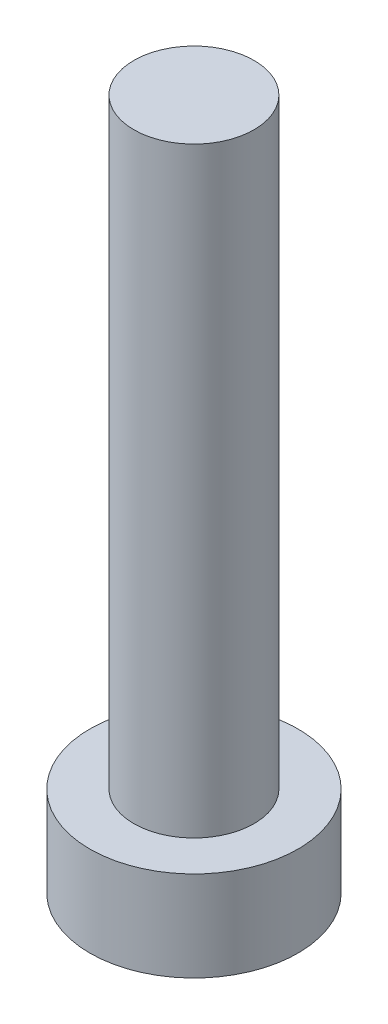
ISO-10303-21;
HEADER;
FILE_DESCRIPTION(('STEP AP214'),'2;1');
FILE_NAME('part.step','',(''),(''),'','','');
FILE_SCHEMA(('AUTOMOTIVE_DESIGN { 1 0 10303 214 1 1 1 1 }'));
ENDSEC;
DATA;
#1=APPLICATION_CONTEXT('core data for automotive mechanical design processes');
#2=APPLICATION_PROTOCOL_DEFINITION('international standard','automotive_design',2000,#1);
#3=PRODUCT_CONTEXT('',#1,'mechanical');
#4=PRODUCT('Part','Part','',(#3));
#5=PRODUCT_RELATED_PRODUCT_CATEGORY('part','',(#4));
#6=PRODUCT_DEFINITION_FORMATION('','',#4);
#7=PRODUCT_DEFINITION_CONTEXT('part definition',#1,'design');
#8=PRODUCT_DEFINITION('design','',#6,#7);
#9=PRODUCT_DEFINITION_SHAPE('','',#8);
#10=(LENGTH_UNIT() NAMED_UNIT(*) SI_UNIT(.MILLI.,.METRE.));
#11=(NAMED_UNIT(*) PLANE_ANGLE_UNIT() SI_UNIT($,.RADIAN.));
#12=(NAMED_UNIT(*) SI_UNIT($,.STERADIAN.) SOLID_ANGLE_UNIT());
#13=UNCERTAINTY_MEASURE_WITH_UNIT(LENGTH_MEASURE(1.E-05),#10,'distance_accuracy_value','');
#14=(GEOMETRIC_REPRESENTATION_CONTEXT(3) GLOBAL_UNCERTAINTY_ASSIGNED_CONTEXT((#13)) GLOBAL_UNIT_ASSIGNED_CONTEXT((#10,
#11,#12)) REPRESENTATION_CONTEXT('',''));
#15=CARTESIAN_POINT('',(0.,0.,0.));
#16=DIRECTION('',(0.,0.,1.));
#17=DIRECTION('',(1.,0.,0.));
#18=AXIS2_PLACEMENT_3D('',#15,#16,#17);
#19=CARTESIAN_POINT('',(0.,10.,0.));
#20=DIRECTION('',(0.,-1.,0.));
#21=DIRECTION('',(0.,0.,-1.));
#22=AXIS2_PLACEMENT_3D('',#19,#20,#21);
#23=CYLINDRICAL_SURFACE('',#22,1.);
#24=CARTESIAN_POINT('',(0.,10.,0.));
#25=DIRECTION('',(0.,1.,0.));
#26=DIRECTION('',(0.,0.,1.));
#27=AXIS2_PLACEMENT_3D('',#24,#25,#26);
#28=CIRCLE('',#27,1.);
#29=CARTESIAN_POINT('',(0.,10.,1.));
#30=VERTEX_POINT('',#29);
#31=EDGE_CURVE('E10',#30,#30,#28,.T.);
#32=ORIENTED_EDGE('',*,*,#31,.F.);
#33=EDGE_LOOP('',(#32));
#34=FACE_BOUND('',#33,.T.);
#35=CARTESIAN_POINT('',(0.,0.,0.));
#36=DIRECTION('',(0.,1.,0.));
#37=DIRECTION('',(0.,0.,1.));
#38=AXIS2_PLACEMENT_3D('',#35,#36,#37);
#39=CIRCLE('',#38,1.);
#40=CARTESIAN_POINT('',(0.,0.,1.));
#41=VERTEX_POINT('',#40);
#42=EDGE_CURVE('E43',#41,#41,#39,.T.);
#43=ORIENTED_EDGE('',*,*,#42,.T.);
#44=EDGE_LOOP('',(#43));
#45=FACE_BOUND('',#44,.T.);
#46=ADVANCED_FACE('F40',(#34,#45),#23,.T.);
#47=CARTESIAN_POINT('',(0.,10.,0.));
#48=DIRECTION('',(0.,1.,0.));
#49=DIRECTION('',(0.,0.,1.));
#50=AXIS2_PLACEMENT_3D('',#47,#48,#49);
#51=PLANE('',#50);
#52=ORIENTED_EDGE('',*,*,#31,.T.);
#53=EDGE_LOOP('',(#52));
#54=FACE_BOUND('',#53,.T.);
#55=ADVANCED_FACE('F72',(#54),#51,.T.);
#56=CARTESIAN_POINT('',(0.,-1.5,0.));
#57=DIRECTION('',(0.,1.,0.));
#58=DIRECTION('',(0.,0.,1.));
#59=AXIS2_PLACEMENT_3D('',#56,#57,#58);
#60=CYLINDRICAL_SURFACE('',#59,1.73205080756888);
#61=CARTESIAN_POINT('',(0.,-1.5,0.));
#62=DIRECTION('',(0.,1.,0.));
#63=DIRECTION('',(0.,0.,1.));
#64=AXIS2_PLACEMENT_3D('',#61,#62,#63);
#65=CIRCLE('',#64,1.73205080756888);
#66=CARTESIAN_POINT('',(0.,-1.5,1.73205080756888));
#67=VERTEX_POINT('',#66);
#68=EDGE_CURVE('E50',#67,#67,#65,.T.);
#69=ORIENTED_EDGE('',*,*,#68,.T.);
#70=EDGE_LOOP('',(#69));
#71=FACE_BOUND('',#70,.T.);
#72=CARTESIAN_POINT('',(0.,0.,0.));
#73=DIRECTION('',(0.,1.,0.));
#74=DIRECTION('',(0.,0.,1.));
#75=AXIS2_PLACEMENT_3D('',#72,#73,#74);
#76=CIRCLE('',#75,1.73205080756888);
#77=CARTESIAN_POINT('',(0.,0.,1.73205080756888));
#78=VERTEX_POINT('',#77);
#79=EDGE_CURVE('E52',#78,#78,#76,.T.);
#80=ORIENTED_EDGE('',*,*,#79,.F.);
#81=EDGE_LOOP('',(#80));
#82=FACE_BOUND('',#81,.T.);
#83=ADVANCED_FACE('F58',(#71,#82),#60,.T.);
#84=CARTESIAN_POINT('',(0.,-1.5,0.));
#85=DIRECTION('',(0.,1.,0.));
#86=DIRECTION('',(0.,0.,1.));
#87=AXIS2_PLACEMENT_3D('',#84,#85,#86);
#88=PLANE('',#87);
#89=ORIENTED_EDGE('',*,*,#68,.F.);
#90=EDGE_LOOP('',(#89));
#91=FACE_BOUND('',#90,.T.);
#92=ADVANCED_FACE('F61',(#91),#88,.F.);
#93=CARTESIAN_POINT('',(0.,0.,0.));
#94=DIRECTION('',(0.,1.,0.));
#95=DIRECTION('',(0.,0.,1.));
#96=AXIS2_PLACEMENT_3D('',#93,#94,#95);
#97=PLANE('',#96);
#98=ORIENTED_EDGE('',*,*,#42,.F.);
#99=EDGE_LOOP('',(#98));
#100=FACE_BOUND('',#99,.T.);
#101=ORIENTED_EDGE('',*,*,#79,.T.);
#102=EDGE_LOOP('',(#101));
#103=FACE_BOUND('',#102,.T.);
#104=ADVANCED_FACE('F63',(#100,#103),#97,.T.);
#105=CLOSED_SHELL('',(#46,#55,#83,#92,#104));
#106=MANIFOLD_SOLID_BREP('B2',#105);
#107=ADVANCED_BREP_SHAPE_REPRESENTATION('',(#18,#106),#14);
#108=SHAPE_DEFINITION_REPRESENTATION(#9,#107);
ENDSEC;
END-ISO-10303-21;
